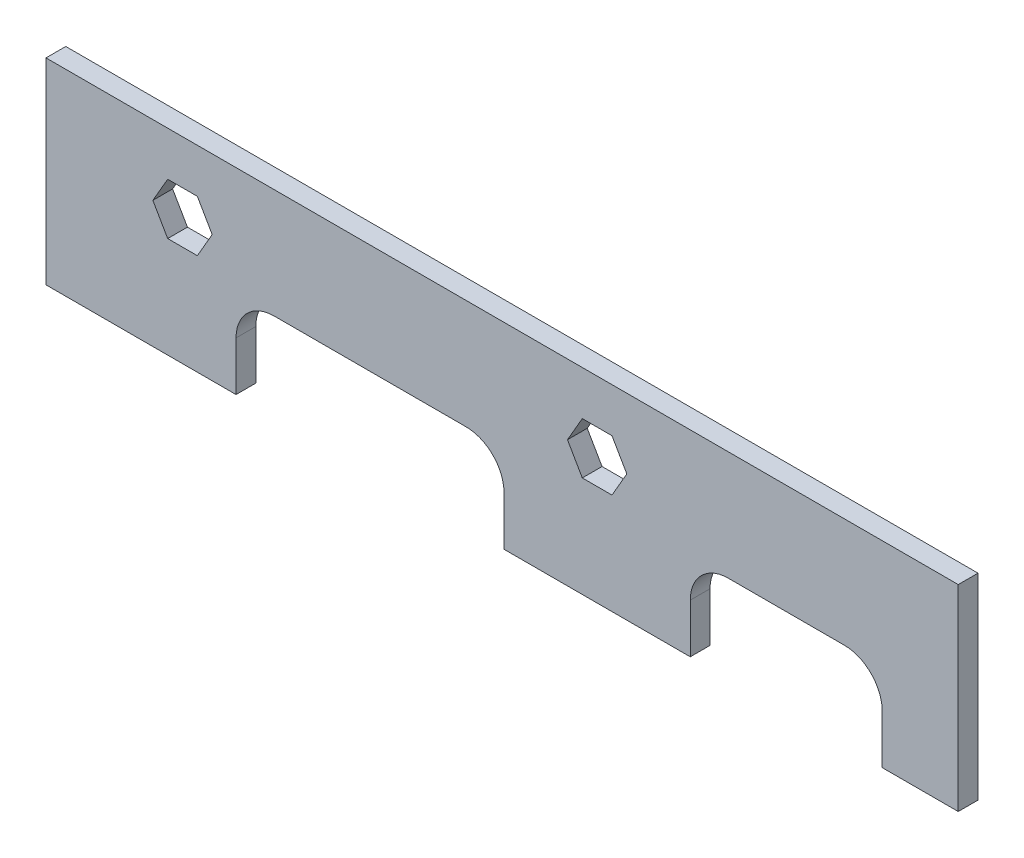
ISO-10303-21;
HEADER;
FILE_DESCRIPTION(('STEP AP214'),'2;1');
FILE_NAME('part.step','',(''),(''),'','','');
FILE_SCHEMA(('AUTOMOTIVE_DESIGN { 1 0 10303 214 1 1 1 1 }'));
ENDSEC;
DATA;
#1=APPLICATION_CONTEXT('core data for automotive mechanical design processes');
#2=APPLICATION_PROTOCOL_DEFINITION('international standard','automotive_design',2000,#1);
#3=PRODUCT_CONTEXT('',#1,'mechanical');
#4=PRODUCT('Part','Part','',(#3));
#5=PRODUCT_RELATED_PRODUCT_CATEGORY('part','',(#4));
#6=PRODUCT_DEFINITION_FORMATION('','',#4);
#7=PRODUCT_DEFINITION_CONTEXT('part definition',#1,'design');
#8=PRODUCT_DEFINITION('design','',#6,#7);
#9=PRODUCT_DEFINITION_SHAPE('','',#8);
#10=(LENGTH_UNIT() NAMED_UNIT(*) SI_UNIT(.MILLI.,.METRE.));
#11=(NAMED_UNIT(*) PLANE_ANGLE_UNIT() SI_UNIT($,.RADIAN.));
#12=(NAMED_UNIT(*) SI_UNIT($,.STERADIAN.) SOLID_ANGLE_UNIT());
#13=UNCERTAINTY_MEASURE_WITH_UNIT(LENGTH_MEASURE(1.E-05),#10,'distance_accuracy_value','');
#14=(GEOMETRIC_REPRESENTATION_CONTEXT(3) GLOBAL_UNCERTAINTY_ASSIGNED_CONTEXT((#13)) GLOBAL_UNIT_ASSIGNED_CONTEXT((#10,
#11,#12)) REPRESENTATION_CONTEXT('',''));
#15=CARTESIAN_POINT('',(0.,0.,0.));
#16=DIRECTION('',(0.,0.,1.));
#17=DIRECTION('',(1.,0.,0.));
#18=AXIS2_PLACEMENT_3D('',#15,#16,#17);
#19=CARTESIAN_POINT('',(8731.13528935043,2943.77517775601,3.302));
#20=DIRECTION('',(0.,0.,1.));
#21=DIRECTION('',(1.,0.,0.));
#22=AXIS2_PLACEMENT_3D('',#19,#20,#21);
#23=PLANE('',#22);
#24=DIRECTION('',(-0.500000000000089,-0.866025403784387,0.));
#25=VECTOR('',#24,1.);
#26=CARTESIAN_POINT('',(8618.11465826431,2961.021777756,3.302));
#27=LINE('',#26,#25);
#28=CARTESIAN_POINT('',(8618.11465826431,2961.021777756,3.302));
#29=VERTEX_POINT('',#28);
#30=CARTESIAN_POINT('',(8615.63632449879,2956.72917775601,3.302));
#31=VERTEX_POINT('',#30);
#32=EDGE_CURVE('E273',#29,#31,#27,.T.);
#33=ORIENTED_EDGE('',*,*,#32,.F.);
#34=DIRECTION('',(-1.,0.,0.));
#35=VECTOR('',#34,1.);
#36=CARTESIAN_POINT('',(8623.07132579536,2961.021777756,3.302));
#37=LINE('',#36,#35);
#38=CARTESIAN_POINT('',(8623.07132579536,2961.021777756,3.302));
#39=VERTEX_POINT('',#38);
#40=EDGE_CURVE('E271',#39,#29,#37,.T.);
#41=ORIENTED_EDGE('',*,*,#40,.F.);
#42=DIRECTION('',(-0.500000000000089,0.866025403784387,0.));
#43=VECTOR('',#42,1.);
#44=CARTESIAN_POINT('',(8625.54965956089,2956.72917775601,3.302));
#45=LINE('',#44,#43);
#46=CARTESIAN_POINT('',(8625.54965956089,2956.72917775601,3.302));
#47=VERTEX_POINT('',#46);
#48=EDGE_CURVE('E283',#47,#39,#45,.T.);
#49=ORIENTED_EDGE('',*,*,#48,.F.);
#50=DIRECTION('',(0.500000000000012,0.866025403784432,0.));
#51=VECTOR('',#50,1.);
#52=CARTESIAN_POINT('',(8623.07132579536,2952.436577756,3.302));
#53=LINE('',#52,#51);
#54=CARTESIAN_POINT('',(8623.07132579536,2952.436577756,3.302));
#55=VERTEX_POINT('',#54);
#56=EDGE_CURVE('E280',#55,#47,#53,.T.);
#57=ORIENTED_EDGE('',*,*,#56,.F.);
#58=DIRECTION('',(1.,0.,0.));
#59=VECTOR('',#58,1.);
#60=CARTESIAN_POINT('',(8618.11465826431,2952.436577756,3.302));
#61=LINE('',#60,#59);
#62=CARTESIAN_POINT('',(8618.11465826431,2952.436577756,3.302));
#63=VERTEX_POINT('',#62);
#64=EDGE_CURVE('E278',#63,#55,#61,.T.);
#65=ORIENTED_EDGE('',*,*,#64,.F.);
#66=DIRECTION('',(0.500000000000012,-0.866025403784432,0.));
#67=VECTOR('',#66,1.);
#68=CARTESIAN_POINT('',(8615.63632449879,2956.72917775601,3.302));
#69=LINE('',#68,#67);
#70=EDGE_CURVE('E276',#31,#63,#69,.T.);
#71=ORIENTED_EDGE('',*,*,#70,.F.);
#72=EDGE_LOOP('',(#33,#41,#49,#57,#65,#71));
#73=FACE_BOUND('',#72,.T.);
#74=DIRECTION('',(0.,1.,0.));
#75=VECTOR('',#74,1.);
#76=CARTESIAN_POINT('',(8750.18528935043,2968.41317775601,3.302));
#77=LINE('',#76,#75);
#78=CARTESIAN_POINT('',(8750.18528935043,2935.573517756,3.302));
#79=VERTEX_POINT('',#78);
#80=CARTESIAN_POINT('',(8750.18528935043,2968.41317775601,3.302));
#81=VERTEX_POINT('',#80);
#82=EDGE_CURVE('E316',#79,#81,#77,.T.);
#83=ORIENTED_EDGE('',*,*,#82,.T.);
#84=DIRECTION('',(-1.,0.,0.));
#85=VECTOR('',#84,1.);
#86=CARTESIAN_POINT('',(8750.18528935043,2968.41317775601,3.302));
#87=LINE('',#86,#85);
#88=CARTESIAN_POINT('',(8597.78528935043,2968.413177756,3.302));
#89=VERTEX_POINT('',#88);
#90=EDGE_CURVE('E319',#81,#89,#87,.T.);
#91=ORIENTED_EDGE('',*,*,#90,.T.);
#92=DIRECTION('',(0.,-1.,0.));
#93=VECTOR('',#92,1.);
#94=CARTESIAN_POINT('',(8597.78528935043,2968.413177756,3.302));
#95=LINE('',#94,#93);
#96=CARTESIAN_POINT('',(8597.78528935043,2935.573517756,3.302));
#97=VERTEX_POINT('',#96);
#98=EDGE_CURVE('E322',#89,#97,#95,.T.);
#99=ORIENTED_EDGE('',*,*,#98,.T.);
#100=DIRECTION('',(1.,0.,0.));
#101=VECTOR('',#100,1.);
#102=CARTESIAN_POINT('',(8597.78528935043,2935.573517756,3.302));
#103=LINE('',#102,#101);
#104=CARTESIAN_POINT('',(8629.53528935044,2935.573517756,3.302));
#105=VERTEX_POINT('',#104);
#106=EDGE_CURVE('E324',#97,#105,#103,.T.);
#107=ORIENTED_EDGE('',*,*,#106,.T.);
#108=DIRECTION('',(-4.33170075179841E-13,1.,0.));
#109=VECTOR('',#108,1.);
#110=CARTESIAN_POINT('',(8629.53528935043,2943.77517775601,3.302));
#111=LINE('',#110,#109);
#112=CARTESIAN_POINT('',(8629.53528935043,2943.77517775601,3.302));
#113=VERTEX_POINT('',#112);
#114=EDGE_CURVE('E326',#105,#113,#111,.T.);
#115=ORIENTED_EDGE('',*,*,#114,.T.);
#116=CARTESIAN_POINT('',(8635.88528935043,2943.77517775601,3.302));
#117=DIRECTION('',(0.,0.,-1.));
#118=DIRECTION('',(1.,0.,0.));
#119=AXIS2_PLACEMENT_3D('',#116,#117,#118);
#120=CIRCLE('',#119,6.34999999999963);
#121=CARTESIAN_POINT('',(8635.88528935043,2950.12517775601,3.302));
#122=VERTEX_POINT('',#121);
#123=EDGE_CURVE('E328',#113,#122,#120,.T.);
#124=ORIENTED_EDGE('',*,*,#123,.T.);
#125=DIRECTION('',(1.,0.,0.));
#126=VECTOR('',#125,1.);
#127=CARTESIAN_POINT('',(8667.95278935043,2950.12517775601,3.302));
#128=LINE('',#127,#126);
#129=CARTESIAN_POINT('',(8667.95278935043,2950.12517775601,3.302));
#130=VERTEX_POINT('',#129);
#131=EDGE_CURVE('E330',#122,#130,#128,.T.);
#132=ORIENTED_EDGE('',*,*,#131,.T.);
#133=CARTESIAN_POINT('',(8667.95278935043,2943.77517775601,3.302));
#134=DIRECTION('',(0.,0.,-1.));
#135=DIRECTION('',(1.,0.,0.));
#136=AXIS2_PLACEMENT_3D('',#133,#134,#135);
#137=CIRCLE('',#136,6.34999999999963);
#138=CARTESIAN_POINT('',(8674.30278935043,2943.77517775601,3.302));
#139=VERTEX_POINT('',#138);
#140=EDGE_CURVE('E332',#130,#139,#137,.T.);
#141=ORIENTED_EDGE('',*,*,#140,.T.);
#142=DIRECTION('',(0.,-1.,0.));
#143=VECTOR('',#142,1.);
#144=CARTESIAN_POINT('',(8674.30278935043,2935.573517756,3.302));
#145=LINE('',#144,#143);
#146=CARTESIAN_POINT('',(8674.30278935043,2935.573517756,3.302));
#147=VERTEX_POINT('',#146);
#148=EDGE_CURVE('E334',#139,#147,#145,.T.);
#149=ORIENTED_EDGE('',*,*,#148,.T.);
#150=DIRECTION('',(1.,0.,0.));
#151=VECTOR('',#150,1.);
#152=CARTESIAN_POINT('',(8674.30278935043,2935.573517756,3.302));
#153=LINE('',#152,#151);
#154=CARTESIAN_POINT('',(8705.41778935043,2935.573517756,3.302));
#155=VERTEX_POINT('',#154);
#156=EDGE_CURVE('E336',#147,#155,#153,.T.);
#157=ORIENTED_EDGE('',*,*,#156,.T.);
#158=DIRECTION('',(0.,1.,0.));
#159=VECTOR('',#158,1.);
#160=CARTESIAN_POINT('',(8705.41778935043,2943.77517775601,3.302));
#161=LINE('',#160,#159);
#162=CARTESIAN_POINT('',(8705.41778935043,2943.77517775601,3.302));
#163=VERTEX_POINT('',#162);
#164=EDGE_CURVE('E338',#155,#163,#161,.T.);
#165=ORIENTED_EDGE('',*,*,#164,.T.);
#166=CARTESIAN_POINT('',(8711.76778935043,2943.77517775601,3.302));
#167=DIRECTION('',(0.,0.,-1.));
#168=DIRECTION('',(1.,0.,0.));
#169=AXIS2_PLACEMENT_3D('',#166,#167,#168);
#170=CIRCLE('',#169,6.35000000000052);
#171=CARTESIAN_POINT('',(8711.76778935043,2950.12517775601,3.302));
#172=VERTEX_POINT('',#171);
#173=EDGE_CURVE('E340',#163,#172,#170,.T.);
#174=ORIENTED_EDGE('',*,*,#173,.T.);
#175=DIRECTION('',(1.,0.,0.));
#176=VECTOR('',#175,1.);
#177=CARTESIAN_POINT('',(8731.13528935043,2950.12517775601,3.302));
#178=LINE('',#177,#176);
#179=CARTESIAN_POINT('',(8731.13528935043,2950.12517775601,3.302));
#180=VERTEX_POINT('',#179);
#181=EDGE_CURVE('E342',#172,#180,#178,.T.);
#182=ORIENTED_EDGE('',*,*,#181,.T.);
#183=CARTESIAN_POINT('',(8731.13528935043,2943.77517775601,3.302));
#184=DIRECTION('',(0.,0.,-1.));
#185=DIRECTION('',(1.,0.,0.));
#186=AXIS2_PLACEMENT_3D('',#183,#184,#185);
#187=CIRCLE('',#186,6.35000000000052);
#188=CARTESIAN_POINT('',(8737.48528935043,2943.77517775601,3.302));
#189=VERTEX_POINT('',#188);
#190=EDGE_CURVE('E344',#180,#189,#187,.T.);
#191=ORIENTED_EDGE('',*,*,#190,.T.);
#192=DIRECTION('',(-4.33170075179841E-13,-1.,0.));
#193=VECTOR('',#192,1.);
#194=CARTESIAN_POINT('',(8737.48528935043,2943.77517775601,3.302));
#195=LINE('',#194,#193);
#196=CARTESIAN_POINT('',(8737.48528935043,2935.573517756,3.302));
#197=VERTEX_POINT('',#196);
#198=EDGE_CURVE('E346',#189,#197,#195,.T.);
#199=ORIENTED_EDGE('',*,*,#198,.T.);
#200=DIRECTION('',(1.,0.,0.));
#201=VECTOR('',#200,1.);
#202=CARTESIAN_POINT('',(8737.48528935043,2935.573517756,3.302));
#203=LINE('',#202,#201);
#204=EDGE_CURVE('E348',#197,#79,#203,.T.);
#205=ORIENTED_EDGE('',*,*,#204,.T.);
#206=EDGE_LOOP('',(#83,#91,#99,#107,#115,#124,#132,#141,#149,#157,#165,#174,#182,#191,#199,#205));
#207=FACE_BOUND('',#206,.T.);
#208=DIRECTION('',(-0.500000000000089,-0.866025403784387,0.));
#209=VECTOR('',#208,1.);
#210=CARTESIAN_POINT('',(8687.38195558491,2961.021777756,3.302));
#211=LINE('',#210,#209);
#212=CARTESIAN_POINT('',(8687.38195558491,2961.021777756,3.302));
#213=VERTEX_POINT('',#212);
#214=CARTESIAN_POINT('',(8684.90362181939,2956.72917775601,3.302));
#215=VERTEX_POINT('',#214);
#216=EDGE_CURVE('E228',#213,#215,#211,.T.);
#217=ORIENTED_EDGE('',*,*,#216,.F.);
#218=DIRECTION('',(-1.,0.,0.));
#219=VECTOR('',#218,1.);
#220=CARTESIAN_POINT('',(8692.33862311596,2961.021777756,3.302));
#221=LINE('',#220,#219);
#222=CARTESIAN_POINT('',(8692.33862311596,2961.021777756,3.302));
#223=VERTEX_POINT('',#222);
#224=EDGE_CURVE('E220',#223,#213,#221,.T.);
#225=ORIENTED_EDGE('',*,*,#224,.F.);
#226=DIRECTION('',(-0.500000000000089,0.866025403784387,0.));
#227=VECTOR('',#226,1.);
#228=CARTESIAN_POINT('',(8694.81695688148,2956.72917775601,3.302));
#229=LINE('',#228,#227);
#230=CARTESIAN_POINT('',(8694.81695688148,2956.72917775601,3.302));
#231=VERTEX_POINT('',#230);
#232=EDGE_CURVE('E249',#231,#223,#229,.T.);
#233=ORIENTED_EDGE('',*,*,#232,.F.);
#234=DIRECTION('',(0.500000000000012,0.866025403784432,0.));
#235=VECTOR('',#234,1.);
#236=CARTESIAN_POINT('',(8692.33862311596,2952.436577756,3.302));
#237=LINE('',#236,#235);
#238=CARTESIAN_POINT('',(8692.33862311596,2952.436577756,3.302));
#239=VERTEX_POINT('',#238);
#240=EDGE_CURVE('E247',#239,#231,#237,.T.);
#241=ORIENTED_EDGE('',*,*,#240,.F.);
#242=DIRECTION('',(1.,0.,0.));
#243=VECTOR('',#242,1.);
#244=CARTESIAN_POINT('',(8687.38195558491,2952.436577756,3.302));
#245=LINE('',#244,#243);
#246=CARTESIAN_POINT('',(8687.38195558491,2952.436577756,3.302));
#247=VERTEX_POINT('',#246);
#248=EDGE_CURVE('E243',#247,#239,#245,.T.);
#249=ORIENTED_EDGE('',*,*,#248,.F.);
#250=DIRECTION('',(0.500000000000012,-0.866025403784432,0.));
#251=VECTOR('',#250,1.);
#252=CARTESIAN_POINT('',(8684.90362181939,2956.72917775601,3.302));
#253=LINE('',#252,#251);
#254=EDGE_CURVE('E241',#215,#247,#253,.T.);
#255=ORIENTED_EDGE('',*,*,#254,.F.);
#256=EDGE_LOOP('',(#217,#225,#233,#241,#249,#255));
#257=FACE_BOUND('',#256,.T.);
#258=ADVANCED_FACE('F35',(#73,#207,#257),#23,.T.);
#259=CARTESIAN_POINT('',(8731.13528935043,2943.77517775601,0.));
#260=DIRECTION('',(0.,0.,1.));
#261=DIRECTION('',(1.,0.,0.));
#262=AXIS2_PLACEMENT_3D('',#259,#260,#261);
#263=PLANE('',#262);
#264=DIRECTION('',(-1.,0.,0.));
#265=VECTOR('',#264,1.);
#266=CARTESIAN_POINT('',(8623.07132579536,2961.021777756,0.));
#267=LINE('',#266,#265);
#268=CARTESIAN_POINT('',(8623.07132579536,2961.021777756,0.));
#269=VERTEX_POINT('',#268);
#270=CARTESIAN_POINT('',(8618.11465826431,2961.021777756,0.));
#271=VERTEX_POINT('',#270);
#272=EDGE_CURVE('E236',#269,#271,#267,.T.);
#273=ORIENTED_EDGE('',*,*,#272,.T.);
#274=DIRECTION('',(-0.500000000000089,-0.866025403784387,0.));
#275=VECTOR('',#274,1.);
#276=CARTESIAN_POINT('',(8618.11465826431,2961.021777756,0.));
#277=LINE('',#276,#275);
#278=CARTESIAN_POINT('',(8615.63632449879,2956.72917775601,0.));
#279=VERTEX_POINT('',#278);
#280=EDGE_CURVE('E288',#271,#279,#277,.T.);
#281=ORIENTED_EDGE('',*,*,#280,.T.);
#282=DIRECTION('',(0.500000000000012,-0.866025403784432,0.));
#283=VECTOR('',#282,1.);
#284=CARTESIAN_POINT('',(8615.63632449879,2956.72917775601,0.));
#285=LINE('',#284,#283);
#286=CARTESIAN_POINT('',(8618.11465826431,2952.436577756,0.));
#287=VERTEX_POINT('',#286);
#288=EDGE_CURVE('E291',#279,#287,#285,.T.);
#289=ORIENTED_EDGE('',*,*,#288,.T.);
#290=DIRECTION('',(1.,0.,0.));
#291=VECTOR('',#290,1.);
#292=CARTESIAN_POINT('',(8618.11465826431,2952.436577756,0.));
#293=LINE('',#292,#291);
#294=CARTESIAN_POINT('',(8623.07132579536,2952.436577756,0.));
#295=VERTEX_POINT('',#294);
#296=EDGE_CURVE('E294',#287,#295,#293,.T.);
#297=ORIENTED_EDGE('',*,*,#296,.T.);
#298=DIRECTION('',(0.500000000000012,0.866025403784432,0.));
#299=VECTOR('',#298,1.);
#300=CARTESIAN_POINT('',(8623.07132579536,2952.436577756,0.));
#301=LINE('',#300,#299);
#302=CARTESIAN_POINT('',(8625.54965956089,2956.72917775601,0.));
#303=VERTEX_POINT('',#302);
#304=EDGE_CURVE('E297',#295,#303,#301,.T.);
#305=ORIENTED_EDGE('',*,*,#304,.T.);
#306=DIRECTION('',(-0.500000000000089,0.866025403784387,0.));
#307=VECTOR('',#306,1.);
#308=CARTESIAN_POINT('',(8625.54965956089,2956.72917775601,0.));
#309=LINE('',#308,#307);
#310=EDGE_CURVE('E274',#303,#269,#309,.T.);
#311=ORIENTED_EDGE('',*,*,#310,.T.);
#312=EDGE_LOOP('',(#273,#281,#289,#297,#305,#311));
#313=FACE_BOUND('',#312,.T.);
#314=DIRECTION('',(0.,1.,0.));
#315=VECTOR('',#314,1.);
#316=CARTESIAN_POINT('',(8750.18528935043,2968.41317775601,0.));
#317=LINE('',#316,#315);
#318=CARTESIAN_POINT('',(8750.18528935043,2935.573517756,0.));
#319=VERTEX_POINT('',#318);
#320=CARTESIAN_POINT('',(8750.18528935043,2968.41317775601,0.));
#321=VERTEX_POINT('',#320);
#322=EDGE_CURVE('E315',#319,#321,#317,.T.);
#323=ORIENTED_EDGE('',*,*,#322,.F.);
#324=DIRECTION('',(1.,0.,0.));
#325=VECTOR('',#324,1.);
#326=CARTESIAN_POINT('',(8737.48528935043,2935.573517756,0.));
#327=LINE('',#326,#325);
#328=CARTESIAN_POINT('',(8737.48528935043,2935.573517756,0.));
#329=VERTEX_POINT('',#328);
#330=EDGE_CURVE('E320',#329,#319,#327,.T.);
#331=ORIENTED_EDGE('',*,*,#330,.F.);
#332=DIRECTION('',(-4.33170075179841E-13,-1.,0.));
#333=VECTOR('',#332,1.);
#334=CARTESIAN_POINT('',(8737.48528935043,2943.77517775601,0.));
#335=LINE('',#334,#333);
#336=CARTESIAN_POINT('',(8737.48528935043,2943.77517775601,0.));
#337=VERTEX_POINT('',#336);
#338=EDGE_CURVE('E379',#337,#329,#335,.T.);
#339=ORIENTED_EDGE('',*,*,#338,.F.);
#340=CARTESIAN_POINT('',(8731.13528935043,2943.77517775601,0.));
#341=DIRECTION('',(0.,0.,-1.));
#342=DIRECTION('',(1.,0.,0.));
#343=AXIS2_PLACEMENT_3D('',#340,#341,#342);
#344=CIRCLE('',#343,6.35000000000052);
#345=CARTESIAN_POINT('',(8731.13528935043,2950.12517775601,0.));
#346=VERTEX_POINT('',#345);
#347=EDGE_CURVE('E377',#346,#337,#344,.T.);
#348=ORIENTED_EDGE('',*,*,#347,.F.);
#349=DIRECTION('',(1.,0.,0.));
#350=VECTOR('',#349,1.);
#351=CARTESIAN_POINT('',(8731.13528935043,2950.12517775601,0.));
#352=LINE('',#351,#350);
#353=CARTESIAN_POINT('',(8711.76778935043,2950.12517775601,0.));
#354=VERTEX_POINT('',#353);
#355=EDGE_CURVE('E375',#354,#346,#352,.T.);
#356=ORIENTED_EDGE('',*,*,#355,.F.);
#357=CARTESIAN_POINT('',(8711.76778935043,2943.77517775601,0.));
#358=DIRECTION('',(0.,0.,-1.));
#359=DIRECTION('',(1.,0.,0.));
#360=AXIS2_PLACEMENT_3D('',#357,#358,#359);
#361=CIRCLE('',#360,6.35000000000052);
#362=CARTESIAN_POINT('',(8705.41778935043,2943.77517775601,0.));
#363=VERTEX_POINT('',#362);
#364=EDGE_CURVE('E373',#363,#354,#361,.T.);
#365=ORIENTED_EDGE('',*,*,#364,.F.);
#366=DIRECTION('',(0.,1.,0.));
#367=VECTOR('',#366,1.);
#368=CARTESIAN_POINT('',(8705.41778935043,2943.77517775601,0.));
#369=LINE('',#368,#367);
#370=CARTESIAN_POINT('',(8705.41778935043,2935.573517756,0.));
#371=VERTEX_POINT('',#370);
#372=EDGE_CURVE('E371',#371,#363,#369,.T.);
#373=ORIENTED_EDGE('',*,*,#372,.F.);
#374=DIRECTION('',(1.,0.,0.));
#375=VECTOR('',#374,1.);
#376=CARTESIAN_POINT('',(8674.30278935043,2935.573517756,0.));
#377=LINE('',#376,#375);
#378=CARTESIAN_POINT('',(8674.30278935043,2935.573517756,0.));
#379=VERTEX_POINT('',#378);
#380=EDGE_CURVE('E369',#379,#371,#377,.T.);
#381=ORIENTED_EDGE('',*,*,#380,.F.);
#382=DIRECTION('',(0.,-1.,0.));
#383=VECTOR('',#382,1.);
#384=CARTESIAN_POINT('',(8674.30278935043,2935.573517756,0.));
#385=LINE('',#384,#383);
#386=CARTESIAN_POINT('',(8674.30278935043,2943.77517775601,0.));
#387=VERTEX_POINT('',#386);
#388=EDGE_CURVE('E367',#387,#379,#385,.T.);
#389=ORIENTED_EDGE('',*,*,#388,.F.);
#390=CARTESIAN_POINT('',(8667.95278935043,2943.77517775601,0.));
#391=DIRECTION('',(0.,0.,-1.));
#392=DIRECTION('',(1.,0.,0.));
#393=AXIS2_PLACEMENT_3D('',#390,#391,#392);
#394=CIRCLE('',#393,6.34999999999963);
#395=CARTESIAN_POINT('',(8667.95278935043,2950.12517775601,0.));
#396=VERTEX_POINT('',#395);
#397=EDGE_CURVE('E365',#396,#387,#394,.T.);
#398=ORIENTED_EDGE('',*,*,#397,.F.);
#399=DIRECTION('',(1.,0.,0.));
#400=VECTOR('',#399,1.);
#401=CARTESIAN_POINT('',(8667.95278935043,2950.12517775601,0.));
#402=LINE('',#401,#400);
#403=CARTESIAN_POINT('',(8635.88528935043,2950.12517775601,0.));
#404=VERTEX_POINT('',#403);
#405=EDGE_CURVE('E363',#404,#396,#402,.T.);
#406=ORIENTED_EDGE('',*,*,#405,.F.);
#407=CARTESIAN_POINT('',(8635.88528935043,2943.77517775601,0.));
#408=DIRECTION('',(0.,0.,-1.));
#409=DIRECTION('',(1.,0.,0.));
#410=AXIS2_PLACEMENT_3D('',#407,#408,#409);
#411=CIRCLE('',#410,6.34999999999963);
#412=CARTESIAN_POINT('',(8629.53528935043,2943.77517775601,0.));
#413=VERTEX_POINT('',#412);
#414=EDGE_CURVE('E361',#413,#404,#411,.T.);
#415=ORIENTED_EDGE('',*,*,#414,.F.);
#416=DIRECTION('',(-4.33170075179841E-13,1.,0.));
#417=VECTOR('',#416,1.);
#418=CARTESIAN_POINT('',(8629.53528935043,2943.77517775601,0.));
#419=LINE('',#418,#417);
#420=CARTESIAN_POINT('',(8629.53528935044,2935.573517756,0.));
#421=VERTEX_POINT('',#420);
#422=EDGE_CURVE('E359',#421,#413,#419,.T.);
#423=ORIENTED_EDGE('',*,*,#422,.F.);
#424=DIRECTION('',(1.,0.,0.));
#425=VECTOR('',#424,1.);
#426=CARTESIAN_POINT('',(8597.78528935043,2935.573517756,0.));
#427=LINE('',#426,#425);
#428=CARTESIAN_POINT('',(8597.78528935043,2935.573517756,0.));
#429=VERTEX_POINT('',#428);
#430=EDGE_CURVE('E357',#429,#421,#427,.T.);
#431=ORIENTED_EDGE('',*,*,#430,.F.);
#432=DIRECTION('',(0.,-1.,0.));
#433=VECTOR('',#432,1.);
#434=CARTESIAN_POINT('',(8597.78528935043,2968.413177756,0.));
#435=LINE('',#434,#433);
#436=CARTESIAN_POINT('',(8597.78528935043,2968.413177756,0.));
#437=VERTEX_POINT('',#436);
#438=EDGE_CURVE('E355',#437,#429,#435,.T.);
#439=ORIENTED_EDGE('',*,*,#438,.F.);
#440=DIRECTION('',(-1.,0.,0.));
#441=VECTOR('',#440,1.);
#442=CARTESIAN_POINT('',(8750.18528935043,2968.41317775601,0.));
#443=LINE('',#442,#441);
#444=EDGE_CURVE('E353',#321,#437,#443,.T.);
#445=ORIENTED_EDGE('',*,*,#444,.F.);
#446=EDGE_LOOP('',(#323,#331,#339,#348,#356,#365,#373,#381,#389,#398,#406,#415,#423,#431,#439,#445));
#447=FACE_BOUND('',#446,.T.);
#448=DIRECTION('',(-1.,0.,0.));
#449=VECTOR('',#448,1.);
#450=CARTESIAN_POINT('',(8692.33862311596,2961.021777756,0.));
#451=LINE('',#450,#449);
#452=CARTESIAN_POINT('',(8692.33862311596,2961.021777756,0.));
#453=VERTEX_POINT('',#452);
#454=CARTESIAN_POINT('',(8687.38195558491,2961.021777756,0.));
#455=VERTEX_POINT('',#454);
#456=EDGE_CURVE('E58',#453,#455,#451,.T.);
#457=ORIENTED_EDGE('',*,*,#456,.T.);
#458=DIRECTION('',(-0.500000000000089,-0.866025403784387,0.));
#459=VECTOR('',#458,1.);
#460=CARTESIAN_POINT('',(8687.38195558491,2961.021777756,0.));
#461=LINE('',#460,#459);
#462=CARTESIAN_POINT('',(8684.90362181939,2956.72917775601,0.));
#463=VERTEX_POINT('',#462);
#464=EDGE_CURVE('E235',#455,#463,#461,.T.);
#465=ORIENTED_EDGE('',*,*,#464,.T.);
#466=DIRECTION('',(0.500000000000012,-0.866025403784432,0.));
#467=VECTOR('',#466,1.);
#468=CARTESIAN_POINT('',(8684.90362181939,2956.72917775601,0.));
#469=LINE('',#468,#467);
#470=CARTESIAN_POINT('',(8687.38195558491,2952.436577756,0.));
#471=VERTEX_POINT('',#470);
#472=EDGE_CURVE('E253',#463,#471,#469,.T.);
#473=ORIENTED_EDGE('',*,*,#472,.T.);
#474=DIRECTION('',(1.,0.,0.));
#475=VECTOR('',#474,1.);
#476=CARTESIAN_POINT('',(8687.38195558491,2952.436577756,0.));
#477=LINE('',#476,#475);
#478=CARTESIAN_POINT('',(8692.33862311596,2952.436577756,0.));
#479=VERTEX_POINT('',#478);
#480=EDGE_CURVE('E256',#471,#479,#477,.T.);
#481=ORIENTED_EDGE('',*,*,#480,.T.);
#482=DIRECTION('',(0.500000000000012,0.866025403784432,0.));
#483=VECTOR('',#482,1.);
#484=CARTESIAN_POINT('',(8692.33862311596,2952.436577756,0.));
#485=LINE('',#484,#483);
#486=CARTESIAN_POINT('',(8694.81695688148,2956.72917775601,0.));
#487=VERTEX_POINT('',#486);
#488=EDGE_CURVE('E259',#479,#487,#485,.T.);
#489=ORIENTED_EDGE('',*,*,#488,.T.);
#490=DIRECTION('',(-0.500000000000089,0.866025403784387,0.));
#491=VECTOR('',#490,1.);
#492=CARTESIAN_POINT('',(8694.81695688148,2956.72917775601,0.));
#493=LINE('',#492,#491);
#494=EDGE_CURVE('E229',#487,#453,#493,.T.);
#495=ORIENTED_EDGE('',*,*,#494,.T.);
#496=EDGE_LOOP('',(#457,#465,#473,#481,#489,#495));
#497=FACE_BOUND('',#496,.T.);
#498=ADVANCED_FACE('F433',(#313,#447,#497),#263,.F.);
#499=CARTESIAN_POINT('',(8750.18528935043,2968.41317775601,3.302));
#500=DIRECTION('',(-1.,0.,0.));
#501=DIRECTION('',(0.,0.,1.));
#502=AXIS2_PLACEMENT_3D('',#499,#500,#501);
#503=PLANE('',#502);
#504=ORIENTED_EDGE('',*,*,#322,.T.);
#505=DIRECTION('',(0.,0.,-1.));
#506=VECTOR('',#505,1.);
#507=CARTESIAN_POINT('',(8750.18528935043,2968.41317775601,3.302));
#508=LINE('',#507,#506);
#509=EDGE_CURVE('E11',#81,#321,#508,.T.);
#510=ORIENTED_EDGE('',*,*,#509,.F.);
#511=ORIENTED_EDGE('',*,*,#82,.F.);
#512=DIRECTION('',(0.,0.,-1.));
#513=VECTOR('',#512,1.);
#514=CARTESIAN_POINT('',(8750.18528935043,2935.573517756,3.302));
#515=LINE('',#514,#513);
#516=EDGE_CURVE('E350',#79,#319,#515,.T.);
#517=ORIENTED_EDGE('',*,*,#516,.T.);
#518=EDGE_LOOP('',(#504,#510,#511,#517));
#519=FACE_BOUND('',#518,.T.);
#520=ADVANCED_FACE('F37',(#519),#503,.F.);
#521=CARTESIAN_POINT('',(8750.18528935043,2968.41317775601,3.302));
#522=DIRECTION('',(0.,-1.,0.));
#523=DIRECTION('',(1.,0.,0.));
#524=AXIS2_PLACEMENT_3D('',#521,#522,#523);
#525=PLANE('',#524);
#526=ORIENTED_EDGE('',*,*,#444,.T.);
#527=DIRECTION('',(0.,0.,-1.));
#528=VECTOR('',#527,1.);
#529=CARTESIAN_POINT('',(8597.78528935043,2968.413177756,3.302));
#530=LINE('',#529,#528);
#531=EDGE_CURVE('E43',#89,#437,#530,.T.);
#532=ORIENTED_EDGE('',*,*,#531,.F.);
#533=ORIENTED_EDGE('',*,*,#90,.F.);
#534=ORIENTED_EDGE('',*,*,#509,.T.);
#535=EDGE_LOOP('',(#526,#532,#533,#534));
#536=FACE_BOUND('',#535,.T.);
#537=ADVANCED_FACE('F450',(#536),#525,.F.);
#538=CARTESIAN_POINT('',(8597.78528935043,2968.413177756,3.302));
#539=DIRECTION('',(1.,0.,0.));
#540=DIRECTION('',(0.,0.,-1.));
#541=AXIS2_PLACEMENT_3D('',#538,#539,#540);
#542=PLANE('',#541);
#543=ORIENTED_EDGE('',*,*,#438,.T.);
#544=DIRECTION('',(0.,0.,-1.));
#545=VECTOR('',#544,1.);
#546=CARTESIAN_POINT('',(8597.78528935043,2935.573517756,3.302));
#547=LINE('',#546,#545);
#548=EDGE_CURVE('E420',#97,#429,#547,.T.);
#549=ORIENTED_EDGE('',*,*,#548,.F.);
#550=ORIENTED_EDGE('',*,*,#98,.F.);
#551=ORIENTED_EDGE('',*,*,#531,.T.);
#552=EDGE_LOOP('',(#543,#549,#550,#551));
#553=FACE_BOUND('',#552,.T.);
#554=ADVANCED_FACE('F427',(#553),#542,.F.);
#555=CARTESIAN_POINT('',(8597.78528935043,2935.573517756,3.302));
#556=DIRECTION('',(0.,1.,0.));
#557=DIRECTION('',(0.,0.,1.));
#558=AXIS2_PLACEMENT_3D('',#555,#556,#557);
#559=PLANE('',#558);
#560=ORIENTED_EDGE('',*,*,#430,.T.);
#561=DIRECTION('',(0.,0.,-1.));
#562=VECTOR('',#561,1.);
#563=CARTESIAN_POINT('',(8629.53528935044,2935.573517756,3.302));
#564=LINE('',#563,#562);
#565=EDGE_CURVE('E417',#105,#421,#564,.T.);
#566=ORIENTED_EDGE('',*,*,#565,.F.);
#567=ORIENTED_EDGE('',*,*,#106,.F.);
#568=ORIENTED_EDGE('',*,*,#548,.T.);
#569=EDGE_LOOP('',(#560,#566,#567,#568));
#570=FACE_BOUND('',#569,.T.);
#571=ADVANCED_FACE('F439',(#570),#559,.F.);
#572=CARTESIAN_POINT('',(8629.53528935043,2943.77517775601,3.302));
#573=DIRECTION('',(-1.,-4.33170075179841E-13,0.));
#574=DIRECTION('',(4.33170075179841E-13,-1.,0.));
#575=AXIS2_PLACEMENT_3D('',#572,#573,#574);
#576=PLANE('',#575);
#577=ORIENTED_EDGE('',*,*,#422,.T.);
#578=DIRECTION('',(0.,0.,-1.));
#579=VECTOR('',#578,1.);
#580=CARTESIAN_POINT('',(8629.53528935043,2943.77517775601,3.302));
#581=LINE('',#580,#579);
#582=EDGE_CURVE('E414',#113,#413,#581,.T.);
#583=ORIENTED_EDGE('',*,*,#582,.F.);
#584=ORIENTED_EDGE('',*,*,#114,.F.);
#585=ORIENTED_EDGE('',*,*,#565,.T.);
#586=EDGE_LOOP('',(#577,#583,#584,#585));
#587=FACE_BOUND('',#586,.T.);
#588=ADVANCED_FACE('F443',(#587),#576,.F.);
#589=CARTESIAN_POINT('',(8635.88528935043,2943.77517775601,3.302));
#590=DIRECTION('',(0.,0.,-1.));
#591=DIRECTION('',(-1.,0.,0.));
#592=AXIS2_PLACEMENT_3D('',#589,#590,#591);
#593=CYLINDRICAL_SURFACE('',#592,6.34999999999963);
#594=ORIENTED_EDGE('',*,*,#414,.T.);
#595=DIRECTION('',(0.,0.,-1.));
#596=VECTOR('',#595,1.);
#597=CARTESIAN_POINT('',(8635.88528935043,2950.12517775601,3.302));
#598=LINE('',#597,#596);
#599=EDGE_CURVE('E411',#122,#404,#598,.T.);
#600=ORIENTED_EDGE('',*,*,#599,.F.);
#601=ORIENTED_EDGE('',*,*,#123,.F.);
#602=ORIENTED_EDGE('',*,*,#582,.T.);
#603=EDGE_LOOP('',(#594,#600,#601,#602));
#604=FACE_BOUND('',#603,.T.);
#605=ADVANCED_FACE('F503',(#604),#593,.F.);
#606=CARTESIAN_POINT('',(8667.95278935043,2950.12517775601,3.302));
#607=DIRECTION('',(0.,1.,0.));
#608=DIRECTION('',(0.,0.,1.));
#609=AXIS2_PLACEMENT_3D('',#606,#607,#608);
#610=PLANE('',#609);
#611=ORIENTED_EDGE('',*,*,#405,.T.);
#612=DIRECTION('',(0.,0.,-1.));
#613=VECTOR('',#612,1.);
#614=CARTESIAN_POINT('',(8667.95278935043,2950.12517775601,3.302));
#615=LINE('',#614,#613);
#616=EDGE_CURVE('E408',#130,#396,#615,.T.);
#617=ORIENTED_EDGE('',*,*,#616,.F.);
#618=ORIENTED_EDGE('',*,*,#131,.F.);
#619=ORIENTED_EDGE('',*,*,#599,.T.);
#620=EDGE_LOOP('',(#611,#617,#618,#619));
#621=FACE_BOUND('',#620,.T.);
#622=ADVANCED_FACE('F500',(#621),#610,.F.);
#623=CARTESIAN_POINT('',(8667.95278935043,2943.77517775601,3.302));
#624=DIRECTION('',(0.,0.,-1.));
#625=DIRECTION('',(-1.,0.,0.));
#626=AXIS2_PLACEMENT_3D('',#623,#624,#625);
#627=CYLINDRICAL_SURFACE('',#626,6.34999999999963);
#628=ORIENTED_EDGE('',*,*,#397,.T.);
#629=DIRECTION('',(0.,0.,-1.));
#630=VECTOR('',#629,1.);
#631=CARTESIAN_POINT('',(8674.30278935043,2943.77517775601,3.302));
#632=LINE('',#631,#630);
#633=EDGE_CURVE('E405',#139,#387,#632,.T.);
#634=ORIENTED_EDGE('',*,*,#633,.F.);
#635=ORIENTED_EDGE('',*,*,#140,.F.);
#636=ORIENTED_EDGE('',*,*,#616,.T.);
#637=EDGE_LOOP('',(#628,#634,#635,#636));
#638=FACE_BOUND('',#637,.T.);
#639=ADVANCED_FACE('F496',(#638),#627,.F.);
#640=CARTESIAN_POINT('',(8674.30278935043,2935.573517756,3.302));
#641=DIRECTION('',(1.,0.,0.));
#642=DIRECTION('',(0.,0.,-1.));
#643=AXIS2_PLACEMENT_3D('',#640,#641,#642);
#644=PLANE('',#643);
#645=ORIENTED_EDGE('',*,*,#388,.T.);
#646=DIRECTION('',(0.,0.,-1.));
#647=VECTOR('',#646,1.);
#648=CARTESIAN_POINT('',(8674.30278935043,2935.573517756,3.302));
#649=LINE('',#648,#647);
#650=EDGE_CURVE('E402',#147,#379,#649,.T.);
#651=ORIENTED_EDGE('',*,*,#650,.F.);
#652=ORIENTED_EDGE('',*,*,#148,.F.);
#653=ORIENTED_EDGE('',*,*,#633,.T.);
#654=EDGE_LOOP('',(#645,#651,#652,#653));
#655=FACE_BOUND('',#654,.T.);
#656=ADVANCED_FACE('F492',(#655),#644,.F.);
#657=CARTESIAN_POINT('',(8674.30278935043,2935.573517756,3.302));
#658=DIRECTION('',(0.,1.,0.));
#659=DIRECTION('',(0.,0.,1.));
#660=AXIS2_PLACEMENT_3D('',#657,#658,#659);
#661=PLANE('',#660);
#662=ORIENTED_EDGE('',*,*,#380,.T.);
#663=DIRECTION('',(0.,0.,-1.));
#664=VECTOR('',#663,1.);
#665=CARTESIAN_POINT('',(8705.41778935043,2935.573517756,3.302));
#666=LINE('',#665,#664);
#667=EDGE_CURVE('E399',#155,#371,#666,.T.);
#668=ORIENTED_EDGE('',*,*,#667,.F.);
#669=ORIENTED_EDGE('',*,*,#156,.F.);
#670=ORIENTED_EDGE('',*,*,#650,.T.);
#671=EDGE_LOOP('',(#662,#668,#669,#670));
#672=FACE_BOUND('',#671,.T.);
#673=ADVANCED_FACE('F487',(#672),#661,.F.);
#674=CARTESIAN_POINT('',(8705.41778935043,2943.77517775601,3.302));
#675=DIRECTION('',(-1.,0.,0.));
#676=DIRECTION('',(0.,0.,1.));
#677=AXIS2_PLACEMENT_3D('',#674,#675,#676);
#678=PLANE('',#677);
#679=ORIENTED_EDGE('',*,*,#372,.T.);
#680=DIRECTION('',(0.,0.,-1.));
#681=VECTOR('',#680,1.);
#682=CARTESIAN_POINT('',(8705.41778935043,2943.77517775601,3.302));
#683=LINE('',#682,#681);
#684=EDGE_CURVE('E396',#163,#363,#683,.T.);
#685=ORIENTED_EDGE('',*,*,#684,.F.);
#686=ORIENTED_EDGE('',*,*,#164,.F.);
#687=ORIENTED_EDGE('',*,*,#667,.T.);
#688=EDGE_LOOP('',(#679,#685,#686,#687));
#689=FACE_BOUND('',#688,.T.);
#690=ADVANCED_FACE('F481',(#689),#678,.F.);
#691=CARTESIAN_POINT('',(8711.76778935043,2943.77517775601,3.302));
#692=DIRECTION('',(0.,0.,-1.));
#693=DIRECTION('',(-1.,0.,0.));
#694=AXIS2_PLACEMENT_3D('',#691,#692,#693);
#695=CYLINDRICAL_SURFACE('',#694,6.35000000000052);
#696=ORIENTED_EDGE('',*,*,#364,.T.);
#697=DIRECTION('',(0.,0.,-1.));
#698=VECTOR('',#697,1.);
#699=CARTESIAN_POINT('',(8711.76778935043,2950.12517775601,3.302));
#700=LINE('',#699,#698);
#701=EDGE_CURVE('E393',#172,#354,#700,.T.);
#702=ORIENTED_EDGE('',*,*,#701,.F.);
#703=ORIENTED_EDGE('',*,*,#173,.F.);
#704=ORIENTED_EDGE('',*,*,#684,.T.);
#705=EDGE_LOOP('',(#696,#702,#703,#704));
#706=FACE_BOUND('',#705,.T.);
#707=ADVANCED_FACE('F477',(#706),#695,.F.);
#708=CARTESIAN_POINT('',(8731.13528935043,2950.12517775601,3.302));
#709=DIRECTION('',(0.,1.,0.));
#710=DIRECTION('',(0.,0.,1.));
#711=AXIS2_PLACEMENT_3D('',#708,#709,#710);
#712=PLANE('',#711);
#713=ORIENTED_EDGE('',*,*,#355,.T.);
#714=DIRECTION('',(0.,0.,-1.));
#715=VECTOR('',#714,1.);
#716=CARTESIAN_POINT('',(8731.13528935043,2950.12517775601,3.302));
#717=LINE('',#716,#715);
#718=EDGE_CURVE('E390',#180,#346,#717,.T.);
#719=ORIENTED_EDGE('',*,*,#718,.F.);
#720=ORIENTED_EDGE('',*,*,#181,.F.);
#721=ORIENTED_EDGE('',*,*,#701,.T.);
#722=EDGE_LOOP('',(#713,#719,#720,#721));
#723=FACE_BOUND('',#722,.T.);
#724=ADVANCED_FACE('F472',(#723),#712,.F.);
#725=CARTESIAN_POINT('',(8731.13528935043,2943.77517775601,3.302));
#726=DIRECTION('',(0.,0.,-1.));
#727=DIRECTION('',(-1.,0.,0.));
#728=AXIS2_PLACEMENT_3D('',#725,#726,#727);
#729=CYLINDRICAL_SURFACE('',#728,6.35000000000052);
#730=ORIENTED_EDGE('',*,*,#347,.T.);
#731=DIRECTION('',(0.,0.,-1.));
#732=VECTOR('',#731,1.);
#733=CARTESIAN_POINT('',(8737.48528935043,2943.77517775601,3.302));
#734=LINE('',#733,#732);
#735=EDGE_CURVE('E387',#189,#337,#734,.T.);
#736=ORIENTED_EDGE('',*,*,#735,.F.);
#737=ORIENTED_EDGE('',*,*,#190,.F.);
#738=ORIENTED_EDGE('',*,*,#718,.T.);
#739=EDGE_LOOP('',(#730,#736,#737,#738));
#740=FACE_BOUND('',#739,.T.);
#741=ADVANCED_FACE('F466',(#740),#729,.F.);
#742=CARTESIAN_POINT('',(8737.48528935043,2943.77517775601,3.302));
#743=DIRECTION('',(1.,-4.33170075179841E-13,0.));
#744=DIRECTION('',(4.33170075179841E-13,1.,0.));
#745=AXIS2_PLACEMENT_3D('',#742,#743,#744);
#746=PLANE('',#745);
#747=ORIENTED_EDGE('',*,*,#338,.T.);
#748=DIRECTION('',(0.,0.,-1.));
#749=VECTOR('',#748,1.);
#750=CARTESIAN_POINT('',(8737.48528935043,2935.573517756,3.302));
#751=LINE('',#750,#749);
#752=EDGE_CURVE('E384',#197,#329,#751,.T.);
#753=ORIENTED_EDGE('',*,*,#752,.F.);
#754=ORIENTED_EDGE('',*,*,#198,.F.);
#755=ORIENTED_EDGE('',*,*,#735,.T.);
#756=EDGE_LOOP('',(#747,#753,#754,#755));
#757=FACE_BOUND('',#756,.T.);
#758=ADVANCED_FACE('F462',(#757),#746,.F.);
#759=CARTESIAN_POINT('',(8737.48528935043,2935.573517756,3.302));
#760=DIRECTION('',(0.,1.,0.));
#761=DIRECTION('',(0.,0.,1.));
#762=AXIS2_PLACEMENT_3D('',#759,#760,#761);
#763=PLANE('',#762);
#764=ORIENTED_EDGE('',*,*,#330,.T.);
#765=ORIENTED_EDGE('',*,*,#516,.F.);
#766=ORIENTED_EDGE('',*,*,#204,.F.);
#767=ORIENTED_EDGE('',*,*,#752,.T.);
#768=EDGE_LOOP('',(#764,#765,#766,#767));
#769=FACE_BOUND('',#768,.T.);
#770=ADVANCED_FACE('F457',(#769),#763,.F.);
#771=CARTESIAN_POINT('',(8623.07132579536,2961.021777756,3.302));
#772=DIRECTION('',(0.,-1.,0.));
#773=DIRECTION('',(0.,0.,-1.));
#774=AXIS2_PLACEMENT_3D('',#771,#772,#773);
#775=PLANE('',#774);
#776=ORIENTED_EDGE('',*,*,#272,.F.);
#777=DIRECTION('',(0.,0.,-1.));
#778=VECTOR('',#777,1.);
#779=CARTESIAN_POINT('',(8623.07132579536,2961.021777756,3.302));
#780=LINE('',#779,#778);
#781=EDGE_CURVE('E285',#39,#269,#780,.T.);
#782=ORIENTED_EDGE('',*,*,#781,.F.);
#783=ORIENTED_EDGE('',*,*,#40,.T.);
#784=DIRECTION('',(0.,0.,-1.));
#785=VECTOR('',#784,1.);
#786=CARTESIAN_POINT('',(8618.11465826431,2961.021777756,3.302));
#787=LINE('',#786,#785);
#788=EDGE_CURVE('E312',#29,#271,#787,.T.);
#789=ORIENTED_EDGE('',*,*,#788,.T.);
#790=EDGE_LOOP('',(#776,#782,#783,#789));
#791=FACE_BOUND('',#790,.T.);
#792=ADVANCED_FACE('F522',(#791),#775,.T.);
#793=CARTESIAN_POINT('',(8618.11465826431,2961.021777756,3.302));
#794=DIRECTION('',(0.866025403784387,-0.500000000000089,0.));
#795=DIRECTION('',(0.500000000000089,0.866025403784387,0.));
#796=AXIS2_PLACEMENT_3D('',#793,#794,#795);
#797=PLANE('',#796);
#798=ORIENTED_EDGE('',*,*,#280,.F.);
#799=ORIENTED_EDGE('',*,*,#788,.F.);
#800=ORIENTED_EDGE('',*,*,#32,.T.);
#801=DIRECTION('',(0.,0.,-1.));
#802=VECTOR('',#801,1.);
#803=CARTESIAN_POINT('',(8615.63632449879,2956.72917775601,3.302));
#804=LINE('',#803,#802);
#805=EDGE_CURVE('E310',#31,#279,#804,.T.);
#806=ORIENTED_EDGE('',*,*,#805,.T.);
#807=EDGE_LOOP('',(#798,#799,#800,#806));
#808=FACE_BOUND('',#807,.T.);
#809=ADVANCED_FACE('F584',(#808),#797,.T.);
#810=CARTESIAN_POINT('',(8615.63632449879,2956.72917775601,3.302));
#811=DIRECTION('',(0.866025403784432,0.500000000000012,0.));
#812=DIRECTION('',(-0.500000000000012,0.866025403784432,0.));
#813=AXIS2_PLACEMENT_3D('',#810,#811,#812);
#814=PLANE('',#813);
#815=ORIENTED_EDGE('',*,*,#288,.F.);
#816=ORIENTED_EDGE('',*,*,#805,.F.);
#817=ORIENTED_EDGE('',*,*,#70,.T.);
#818=DIRECTION('',(0.,0.,-1.));
#819=VECTOR('',#818,1.);
#820=CARTESIAN_POINT('',(8618.11465826431,2952.436577756,3.302));
#821=LINE('',#820,#819);
#822=EDGE_CURVE('E308',#63,#287,#821,.T.);
#823=ORIENTED_EDGE('',*,*,#822,.T.);
#824=EDGE_LOOP('',(#815,#816,#817,#823));
#825=FACE_BOUND('',#824,.T.);
#826=ADVANCED_FACE('F591',(#825),#814,.T.);
#827=CARTESIAN_POINT('',(8618.11465826431,2952.436577756,3.302));
#828=DIRECTION('',(0.,1.,0.));
#829=DIRECTION('',(0.,0.,1.));
#830=AXIS2_PLACEMENT_3D('',#827,#828,#829);
#831=PLANE('',#830);
#832=ORIENTED_EDGE('',*,*,#296,.F.);
#833=ORIENTED_EDGE('',*,*,#822,.F.);
#834=ORIENTED_EDGE('',*,*,#64,.T.);
#835=DIRECTION('',(0.,0.,-1.));
#836=VECTOR('',#835,1.);
#837=CARTESIAN_POINT('',(8623.07132579536,2952.436577756,3.302));
#838=LINE('',#837,#836);
#839=EDGE_CURVE('E306',#55,#295,#838,.T.);
#840=ORIENTED_EDGE('',*,*,#839,.T.);
#841=EDGE_LOOP('',(#832,#833,#834,#840));
#842=FACE_BOUND('',#841,.T.);
#843=ADVANCED_FACE('F598',(#842),#831,.T.);
#844=CARTESIAN_POINT('',(8623.07132579536,2952.436577756,3.302));
#845=DIRECTION('',(-0.866025403784432,0.500000000000012,0.));
#846=DIRECTION('',(-0.500000000000012,-0.866025403784432,0.));
#847=AXIS2_PLACEMENT_3D('',#844,#845,#846);
#848=PLANE('',#847);
#849=ORIENTED_EDGE('',*,*,#304,.F.);
#850=ORIENTED_EDGE('',*,*,#839,.F.);
#851=ORIENTED_EDGE('',*,*,#56,.T.);
#852=DIRECTION('',(0.,0.,-1.));
#853=VECTOR('',#852,1.);
#854=CARTESIAN_POINT('',(8625.54965956089,2956.72917775601,3.302));
#855=LINE('',#854,#853);
#856=EDGE_CURVE('E304',#47,#303,#855,.T.);
#857=ORIENTED_EDGE('',*,*,#856,.T.);
#858=EDGE_LOOP('',(#849,#850,#851,#857));
#859=FACE_BOUND('',#858,.T.);
#860=ADVANCED_FACE('F606',(#859),#848,.T.);
#861=CARTESIAN_POINT('',(8625.54965956089,2956.72917775601,3.302));
#862=DIRECTION('',(-0.866025403784387,-0.500000000000089,0.));
#863=DIRECTION('',(0.500000000000089,-0.866025403784387,0.));
#864=AXIS2_PLACEMENT_3D('',#861,#862,#863);
#865=PLANE('',#864);
#866=ORIENTED_EDGE('',*,*,#310,.F.);
#867=ORIENTED_EDGE('',*,*,#856,.F.);
#868=ORIENTED_EDGE('',*,*,#48,.T.);
#869=ORIENTED_EDGE('',*,*,#781,.T.);
#870=EDGE_LOOP('',(#866,#867,#868,#869));
#871=FACE_BOUND('',#870,.T.);
#872=ADVANCED_FACE('F614',(#871),#865,.T.);
#873=CARTESIAN_POINT('',(8692.33862311596,2961.021777756,3.302));
#874=DIRECTION('',(0.,-1.,0.));
#875=DIRECTION('',(0.,0.,-1.));
#876=AXIS2_PLACEMENT_3D('',#873,#874,#875);
#877=PLANE('',#876);
#878=ORIENTED_EDGE('',*,*,#456,.F.);
#879=DIRECTION('',(0.,0.,-1.));
#880=VECTOR('',#879,1.);
#881=CARTESIAN_POINT('',(8692.33862311596,2961.021777756,3.302));
#882=LINE('',#881,#880);
#883=EDGE_CURVE('E224',#223,#453,#882,.T.);
#884=ORIENTED_EDGE('',*,*,#883,.F.);
#885=ORIENTED_EDGE('',*,*,#224,.T.);
#886=DIRECTION('',(0.,0.,-1.));
#887=VECTOR('',#886,1.);
#888=CARTESIAN_POINT('',(8687.38195558491,2961.021777756,3.302));
#889=LINE('',#888,#887);
#890=EDGE_CURVE('E223',#213,#455,#889,.T.);
#891=ORIENTED_EDGE('',*,*,#890,.T.);
#892=EDGE_LOOP('',(#878,#884,#885,#891));
#893=FACE_BOUND('',#892,.T.);
#894=ADVANCED_FACE('F222',(#893),#877,.T.);
#895=CARTESIAN_POINT('',(8687.38195558491,2961.021777756,3.302));
#896=DIRECTION('',(0.866025403784387,-0.500000000000089,0.));
#897=DIRECTION('',(0.500000000000089,0.866025403784387,0.));
#898=AXIS2_PLACEMENT_3D('',#895,#896,#897);
#899=PLANE('',#898);
#900=ORIENTED_EDGE('',*,*,#464,.F.);
#901=ORIENTED_EDGE('',*,*,#890,.F.);
#902=ORIENTED_EDGE('',*,*,#216,.T.);
#903=DIRECTION('',(0.,0.,-1.));
#904=VECTOR('',#903,1.);
#905=CARTESIAN_POINT('',(8684.90362181939,2956.72917775601,3.302));
#906=LINE('',#905,#904);
#907=EDGE_CURVE('E237',#215,#463,#906,.T.);
#908=ORIENTED_EDGE('',*,*,#907,.T.);
#909=EDGE_LOOP('',(#900,#901,#902,#908));
#910=FACE_BOUND('',#909,.T.);
#911=ADVANCED_FACE('F232',(#910),#899,.T.);
#912=CARTESIAN_POINT('',(8684.90362181939,2956.72917775601,3.302));
#913=DIRECTION('',(0.866025403784432,0.500000000000012,0.));
#914=DIRECTION('',(-0.500000000000012,0.866025403784432,0.));
#915=AXIS2_PLACEMENT_3D('',#912,#913,#914);
#916=PLANE('',#915);
#917=ORIENTED_EDGE('',*,*,#472,.F.);
#918=ORIENTED_EDGE('',*,*,#907,.F.);
#919=ORIENTED_EDGE('',*,*,#254,.T.);
#920=DIRECTION('',(0.,0.,-1.));
#921=VECTOR('',#920,1.);
#922=CARTESIAN_POINT('',(8687.38195558491,2952.436577756,3.302));
#923=LINE('',#922,#921);
#924=EDGE_CURVE('E268',#247,#471,#923,.T.);
#925=ORIENTED_EDGE('',*,*,#924,.T.);
#926=EDGE_LOOP('',(#917,#918,#919,#925));
#927=FACE_BOUND('',#926,.T.);
#928=ADVANCED_FACE('F635',(#927),#916,.T.);
#929=CARTESIAN_POINT('',(8687.38195558491,2952.436577756,3.302));
#930=DIRECTION('',(0.,1.,0.));
#931=DIRECTION('',(0.,0.,1.));
#932=AXIS2_PLACEMENT_3D('',#929,#930,#931);
#933=PLANE('',#932);
#934=ORIENTED_EDGE('',*,*,#480,.F.);
#935=ORIENTED_EDGE('',*,*,#924,.F.);
#936=ORIENTED_EDGE('',*,*,#248,.T.);
#937=DIRECTION('',(0.,0.,-1.));
#938=VECTOR('',#937,1.);
#939=CARTESIAN_POINT('',(8692.33862311596,2952.436577756,3.302));
#940=LINE('',#939,#938);
#941=EDGE_CURVE('E266',#239,#479,#940,.T.);
#942=ORIENTED_EDGE('',*,*,#941,.T.);
#943=EDGE_LOOP('',(#934,#935,#936,#942));
#944=FACE_BOUND('',#943,.T.);
#945=ADVANCED_FACE('F642',(#944),#933,.T.);
#946=CARTESIAN_POINT('',(8692.33862311596,2952.436577756,3.302));
#947=DIRECTION('',(-0.866025403784432,0.500000000000012,0.));
#948=DIRECTION('',(-0.500000000000012,-0.866025403784432,0.));
#949=AXIS2_PLACEMENT_3D('',#946,#947,#948);
#950=PLANE('',#949);
#951=ORIENTED_EDGE('',*,*,#488,.F.);
#952=ORIENTED_EDGE('',*,*,#941,.F.);
#953=ORIENTED_EDGE('',*,*,#240,.T.);
#954=DIRECTION('',(0.,0.,-1.));
#955=VECTOR('',#954,1.);
#956=CARTESIAN_POINT('',(8694.81695688148,2956.72917775601,3.302));
#957=LINE('',#956,#955);
#958=EDGE_CURVE('E50',#231,#487,#957,.T.);
#959=ORIENTED_EDGE('',*,*,#958,.T.);
#960=EDGE_LOOP('',(#951,#952,#953,#959));
#961=FACE_BOUND('',#960,.T.);
#962=ADVANCED_FACE('F650',(#961),#950,.T.);
#963=CARTESIAN_POINT('',(8694.81695688148,2956.72917775601,3.302));
#964=DIRECTION('',(-0.866025403784387,-0.500000000000089,0.));
#965=DIRECTION('',(0.500000000000089,-0.866025403784387,0.));
#966=AXIS2_PLACEMENT_3D('',#963,#964,#965);
#967=PLANE('',#966);
#968=ORIENTED_EDGE('',*,*,#494,.F.);
#969=ORIENTED_EDGE('',*,*,#958,.F.);
#970=ORIENTED_EDGE('',*,*,#232,.T.);
#971=ORIENTED_EDGE('',*,*,#883,.T.);
#972=EDGE_LOOP('',(#968,#969,#970,#971));
#973=FACE_BOUND('',#972,.T.);
#974=ADVANCED_FACE('F658',(#973),#967,.T.);
#975=CLOSED_SHELL('',(#258,#498,#520,#537,#554,#571,#588,#605,#622,#639,#656,#673,#690,#707,
#724,#741,#758,#770,#792,#809,#826,#843,#860,#872,#894,#911,#928,#945,#962,#974));
#976=MANIFOLD_SOLID_BREP('B2',#975);
#977=ADVANCED_BREP_SHAPE_REPRESENTATION('',(#18,#976),#14);
#978=SHAPE_DEFINITION_REPRESENTATION(#9,#977);
ENDSEC;
END-ISO-10303-21;
